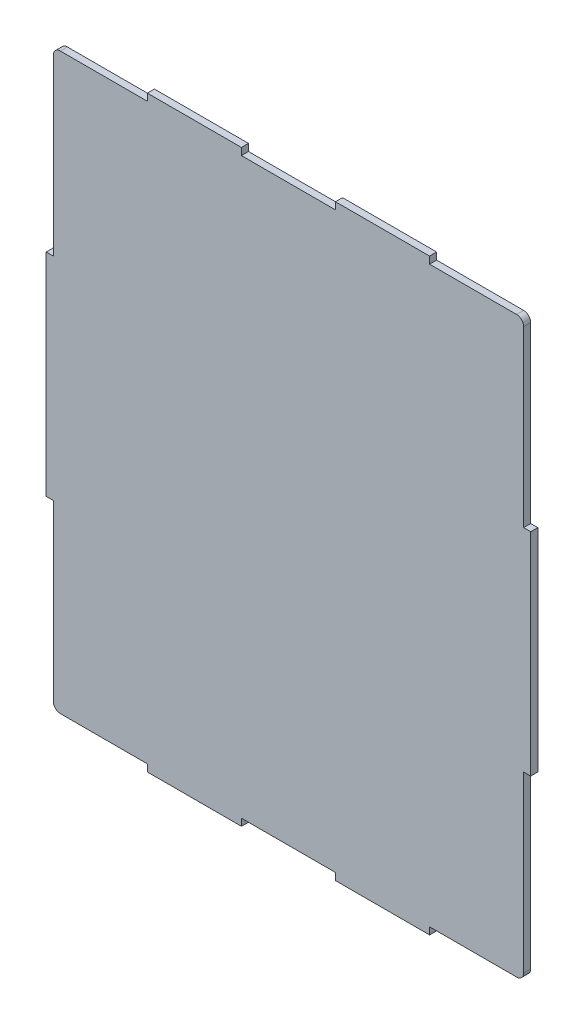
ISO-10303-21;
HEADER;
FILE_DESCRIPTION(('STEP AP214'),'2;1');
FILE_NAME('part.step','',(''),(''),'','','');
FILE_SCHEMA(('AUTOMOTIVE_DESIGN { 1 0 10303 214 1 1 1 1 }'));
ENDSEC;
DATA;
#1=APPLICATION_CONTEXT('core data for automotive mechanical design processes');
#2=APPLICATION_PROTOCOL_DEFINITION('international standard','automotive_design',2000,#1);
#3=PRODUCT_CONTEXT('',#1,'mechanical');
#4=PRODUCT('Part','Part','',(#3));
#5=PRODUCT_RELATED_PRODUCT_CATEGORY('part','',(#4));
#6=PRODUCT_DEFINITION_FORMATION('','',#4);
#7=PRODUCT_DEFINITION_CONTEXT('part definition',#1,'design');
#8=PRODUCT_DEFINITION('design','',#6,#7);
#9=PRODUCT_DEFINITION_SHAPE('','',#8);
#10=(LENGTH_UNIT() NAMED_UNIT(*) SI_UNIT(.MILLI.,.METRE.));
#11=(NAMED_UNIT(*) PLANE_ANGLE_UNIT() SI_UNIT($,.RADIAN.));
#12=(NAMED_UNIT(*) SI_UNIT($,.STERADIAN.) SOLID_ANGLE_UNIT());
#13=UNCERTAINTY_MEASURE_WITH_UNIT(LENGTH_MEASURE(1.E-05),#10,'distance_accuracy_value','');
#14=(GEOMETRIC_REPRESENTATION_CONTEXT(3) GLOBAL_UNCERTAINTY_ASSIGNED_CONTEXT((#13)) GLOBAL_UNIT_ASSIGNED_CONTEXT((#10,
#11,#12)) REPRESENTATION_CONTEXT('',''));
#15=CARTESIAN_POINT('',(0.,0.,0.));
#16=DIRECTION('',(0.,0.,1.));
#17=DIRECTION('',(1.,0.,0.));
#18=AXIS2_PLACEMENT_3D('',#15,#16,#17);
#19=CARTESIAN_POINT('',(0.,122.,3.));
#20=DIRECTION('',(0.,-1.,0.));
#21=DIRECTION('',(1.,0.,0.));
#22=AXIS2_PLACEMENT_3D('',#19,#20,#21);
#23=PLANE('',#22);
#24=DIRECTION('',(-1.,0.,0.));
#25=VECTOR('',#24,1.);
#26=CARTESIAN_POINT('',(0.,122.,0.));
#27=LINE('',#26,#25);
#28=CARTESIAN_POINT('',(96.9999999999999,122.,0.));
#29=VERTEX_POINT('',#28);
#30=CARTESIAN_POINT('',(60.,122.,0.));
#31=VERTEX_POINT('',#30);
#32=EDGE_CURVE('E384',#29,#31,#27,.T.);
#33=ORIENTED_EDGE('',*,*,#32,.T.);
#34=DIRECTION('',(0.,0.,-1.));
#35=VECTOR('',#34,1.);
#36=CARTESIAN_POINT('',(60.,122.,3.));
#37=LINE('',#36,#35);
#38=CARTESIAN_POINT('',(60.,122.,3.));
#39=VERTEX_POINT('',#38);
#40=EDGE_CURVE('E11',#39,#31,#37,.T.);
#41=ORIENTED_EDGE('',*,*,#40,.F.);
#42=DIRECTION('',(-1.,0.,0.));
#43=VECTOR('',#42,1.);
#44=CARTESIAN_POINT('',(0.,122.,3.));
#45=LINE('',#44,#43);
#46=CARTESIAN_POINT('',(96.9999999999999,122.,3.));
#47=VERTEX_POINT('',#46);
#48=EDGE_CURVE('E161',#47,#39,#45,.T.);
#49=ORIENTED_EDGE('',*,*,#48,.F.);
#50=DIRECTION('',(0.,0.,-1.));
#51=VECTOR('',#50,1.);
#52=CARTESIAN_POINT('',(96.9999999999999,122.,3.));
#53=LINE('',#52,#51);
#54=EDGE_CURVE('E52',#47,#29,#53,.T.);
#55=ORIENTED_EDGE('',*,*,#54,.T.);
#56=EDGE_LOOP('',(#33,#41,#49,#55));
#57=FACE_BOUND('',#56,.T.);
#58=ADVANCED_FACE('F35',(#57),#23,.F.);
#59=CARTESIAN_POINT('',(60.,0.,3.));
#60=DIRECTION('',(1.,0.,0.));
#61=DIRECTION('',(0.,0.,-1.));
#62=AXIS2_PLACEMENT_3D('',#59,#60,#61);
#63=PLANE('',#62);
#64=DIRECTION('',(0.,-1.,0.));
#65=VECTOR('',#64,1.);
#66=CARTESIAN_POINT('',(60.,0.,0.));
#67=LINE('',#66,#65);
#68=CARTESIAN_POINT('',(60.,125.,0.));
#69=VERTEX_POINT('',#68);
#70=EDGE_CURVE('E382',#69,#31,#67,.T.);
#71=ORIENTED_EDGE('',*,*,#70,.F.);
#72=DIRECTION('',(0.,0.,-1.));
#73=VECTOR('',#72,1.);
#74=CARTESIAN_POINT('',(60.,125.,3.));
#75=LINE('',#74,#73);
#76=CARTESIAN_POINT('',(60.,125.,3.));
#77=VERTEX_POINT('',#76);
#78=EDGE_CURVE('E44',#77,#69,#75,.T.);
#79=ORIENTED_EDGE('',*,*,#78,.F.);
#80=DIRECTION('',(0.,-1.,0.));
#81=VECTOR('',#80,1.);
#82=CARTESIAN_POINT('',(60.,0.,3.));
#83=LINE('',#82,#81);
#84=EDGE_CURVE('E335',#77,#39,#83,.T.);
#85=ORIENTED_EDGE('',*,*,#84,.T.);
#86=ORIENTED_EDGE('',*,*,#40,.T.);
#87=EDGE_LOOP('',(#71,#79,#85,#86));
#88=FACE_BOUND('',#87,.T.);
#89=ADVANCED_FACE('F37',(#88),#63,.T.);
#90=CARTESIAN_POINT('',(0.,125.,3.));
#91=DIRECTION('',(0.,1.,0.));
#92=DIRECTION('',(0.,0.,1.));
#93=AXIS2_PLACEMENT_3D('',#90,#91,#92);
#94=PLANE('',#93);
#95=DIRECTION('',(1.,0.,0.));
#96=VECTOR('',#95,1.);
#97=CARTESIAN_POINT('',(0.,125.,0.));
#98=LINE('',#97,#96);
#99=CARTESIAN_POINT('',(20.,125.,0.));
#100=VERTEX_POINT('',#99);
#101=EDGE_CURVE('E378',#100,#69,#98,.T.);
#102=ORIENTED_EDGE('',*,*,#101,.F.);
#103=DIRECTION('',(0.,0.,-1.));
#104=VECTOR('',#103,1.);
#105=CARTESIAN_POINT('',(20.,125.,3.));
#106=LINE('',#105,#104);
#107=CARTESIAN_POINT('',(20.,125.,3.));
#108=VERTEX_POINT('',#107);
#109=EDGE_CURVE('E372',#108,#100,#106,.T.);
#110=ORIENTED_EDGE('',*,*,#109,.F.);
#111=DIRECTION('',(1.,0.,0.));
#112=VECTOR('',#111,1.);
#113=CARTESIAN_POINT('',(0.,125.,3.));
#114=LINE('',#113,#112);
#115=EDGE_CURVE('E332',#108,#77,#114,.T.);
#116=ORIENTED_EDGE('',*,*,#115,.T.);
#117=ORIENTED_EDGE('',*,*,#78,.T.);
#118=EDGE_LOOP('',(#102,#110,#116,#117));
#119=FACE_BOUND('',#118,.T.);
#120=ADVANCED_FACE('F376',(#119),#94,.T.);
#121=CARTESIAN_POINT('',(19.9999999999998,0.,3.));
#122=DIRECTION('',(-1.,0.,0.));
#123=DIRECTION('',(0.,-1.,0.));
#124=AXIS2_PLACEMENT_3D('',#121,#122,#123);
#125=PLANE('',#124);
#126=DIRECTION('',(0.,1.,0.));
#127=VECTOR('',#126,1.);
#128=CARTESIAN_POINT('',(19.9999999999998,0.,0.));
#129=LINE('',#128,#127);
#130=CARTESIAN_POINT('',(20.,122.,0.));
#131=VERTEX_POINT('',#130);
#132=EDGE_CURVE('E388',#131,#100,#129,.T.);
#133=ORIENTED_EDGE('',*,*,#132,.F.);
#134=DIRECTION('',(0.,0.,-1.));
#135=VECTOR('',#134,1.);
#136=CARTESIAN_POINT('',(20.,122.,3.));
#137=LINE('',#136,#135);
#138=CARTESIAN_POINT('',(20.,122.,3.));
#139=VERTEX_POINT('',#138);
#140=EDGE_CURVE('E357',#139,#131,#137,.T.);
#141=ORIENTED_EDGE('',*,*,#140,.F.);
#142=DIRECTION('',(0.,1.,0.));
#143=VECTOR('',#142,1.);
#144=CARTESIAN_POINT('',(19.9999999999998,0.,3.));
#145=LINE('',#144,#143);
#146=EDGE_CURVE('E329',#139,#108,#145,.T.);
#147=ORIENTED_EDGE('',*,*,#146,.T.);
#148=ORIENTED_EDGE('',*,*,#109,.T.);
#149=EDGE_LOOP('',(#133,#141,#147,#148));
#150=FACE_BOUND('',#149,.T.);
#151=ADVANCED_FACE('F511',(#150),#125,.T.);
#152=CARTESIAN_POINT('',(-20.,122.,0.));
#153=VERTEX_POINT('',#152);
#154=EDGE_CURVE('E353',#131,#153,#27,.T.);
#155=ORIENTED_EDGE('',*,*,#154,.T.);
#156=DIRECTION('',(0.,0.,-1.));
#157=VECTOR('',#156,1.);
#158=CARTESIAN_POINT('',(-20.,122.,3.));
#159=LINE('',#158,#157);
#160=CARTESIAN_POINT('',(-20.,122.,3.));
#161=VERTEX_POINT('',#160);
#162=EDGE_CURVE('E350',#161,#153,#159,.T.);
#163=ORIENTED_EDGE('',*,*,#162,.F.);
#164=EDGE_CURVE('E328',#139,#161,#45,.T.);
#165=ORIENTED_EDGE('',*,*,#164,.F.);
#166=ORIENTED_EDGE('',*,*,#140,.T.);
#167=EDGE_LOOP('',(#155,#163,#165,#166));
#168=FACE_BOUND('',#167,.T.);
#169=ADVANCED_FACE('F351',(#168),#23,.F.);
#170=CARTESIAN_POINT('',(-19.9999999999999,0.,3.));
#171=DIRECTION('',(1.,0.,0.));
#172=DIRECTION('',(0.,1.,0.));
#173=AXIS2_PLACEMENT_3D('',#170,#171,#172);
#174=PLANE('',#173);
#175=DIRECTION('',(0.,-1.,0.));
#176=VECTOR('',#175,1.);
#177=CARTESIAN_POINT('',(-19.9999999999999,0.,0.));
#178=LINE('',#177,#176);
#179=CARTESIAN_POINT('',(-20.,125.,0.));
#180=VERTEX_POINT('',#179);
#181=EDGE_CURVE('E361',#180,#153,#178,.T.);
#182=ORIENTED_EDGE('',*,*,#181,.F.);
#183=DIRECTION('',(0.,0.,-1.));
#184=VECTOR('',#183,1.);
#185=CARTESIAN_POINT('',(-20.,125.,3.));
#186=LINE('',#185,#184);
#187=CARTESIAN_POINT('',(-20.,125.,3.));
#188=VERTEX_POINT('',#187);
#189=EDGE_CURVE('E358',#188,#180,#186,.T.);
#190=ORIENTED_EDGE('',*,*,#189,.F.);
#191=DIRECTION('',(0.,-1.,0.));
#192=VECTOR('',#191,1.);
#193=CARTESIAN_POINT('',(-19.9999999999999,0.,3.));
#194=LINE('',#193,#192);
#195=EDGE_CURVE('E325',#188,#161,#194,.T.);
#196=ORIENTED_EDGE('',*,*,#195,.T.);
#197=ORIENTED_EDGE('',*,*,#162,.T.);
#198=EDGE_LOOP('',(#182,#190,#196,#197));
#199=FACE_BOUND('',#198,.T.);
#200=ADVANCED_FACE('F360',(#199),#174,.T.);
#201=CARTESIAN_POINT('',(0.,125.,3.));
#202=DIRECTION('',(0.,1.,0.));
#203=DIRECTION('',(0.,0.,1.));
#204=AXIS2_PLACEMENT_3D('',#201,#202,#203);
#205=PLANE('',#204);
#206=DIRECTION('',(1.,0.,0.));
#207=VECTOR('',#206,1.);
#208=CARTESIAN_POINT('',(0.,125.,0.));
#209=LINE('',#208,#207);
#210=CARTESIAN_POINT('',(-60.,125.,0.));
#211=VERTEX_POINT('',#210);
#212=EDGE_CURVE('E394',#211,#180,#209,.T.);
#213=ORIENTED_EDGE('',*,*,#212,.F.);
#214=DIRECTION('',(0.,0.,-1.));
#215=VECTOR('',#214,1.);
#216=CARTESIAN_POINT('',(-60.,125.,3.));
#217=LINE('',#216,#215);
#218=CARTESIAN_POINT('',(-60.,125.,3.));
#219=VERTEX_POINT('',#218);
#220=EDGE_CURVE('E365',#219,#211,#217,.T.);
#221=ORIENTED_EDGE('',*,*,#220,.F.);
#222=DIRECTION('',(1.,0.,0.));
#223=VECTOR('',#222,1.);
#224=CARTESIAN_POINT('',(0.,125.,3.));
#225=LINE('',#224,#223);
#226=EDGE_CURVE('E322',#219,#188,#225,.T.);
#227=ORIENTED_EDGE('',*,*,#226,.T.);
#228=ORIENTED_EDGE('',*,*,#189,.T.);
#229=EDGE_LOOP('',(#213,#221,#227,#228));
#230=FACE_BOUND('',#229,.T.);
#231=ADVANCED_FACE('F509',(#230),#205,.T.);
#232=CARTESIAN_POINT('',(-60.,0.,3.));
#233=DIRECTION('',(-1.,0.,0.));
#234=DIRECTION('',(0.,0.,1.));
#235=AXIS2_PLACEMENT_3D('',#232,#233,#234);
#236=PLANE('',#235);
#237=DIRECTION('',(0.,1.,0.));
#238=VECTOR('',#237,1.);
#239=CARTESIAN_POINT('',(-60.,0.,0.));
#240=LINE('',#239,#238);
#241=CARTESIAN_POINT('',(-60.,122.,0.));
#242=VERTEX_POINT('',#241);
#243=EDGE_CURVE('E396',#242,#211,#240,.T.);
#244=ORIENTED_EDGE('',*,*,#243,.F.);
#245=DIRECTION('',(0.,0.,-1.));
#246=VECTOR('',#245,1.);
#247=CARTESIAN_POINT('',(-60.,122.,3.));
#248=LINE('',#247,#246);
#249=CARTESIAN_POINT('',(-60.,122.,3.));
#250=VERTEX_POINT('',#249);
#251=EDGE_CURVE('E367',#250,#242,#248,.T.);
#252=ORIENTED_EDGE('',*,*,#251,.F.);
#253=DIRECTION('',(0.,1.,0.));
#254=VECTOR('',#253,1.);
#255=CARTESIAN_POINT('',(-60.,0.,3.));
#256=LINE('',#255,#254);
#257=EDGE_CURVE('E319',#250,#219,#256,.T.);
#258=ORIENTED_EDGE('',*,*,#257,.T.);
#259=ORIENTED_EDGE('',*,*,#220,.T.);
#260=EDGE_LOOP('',(#244,#252,#258,#259));
#261=FACE_BOUND('',#260,.T.);
#262=ADVANCED_FACE('F508',(#261),#236,.T.);
#263=CARTESIAN_POINT('',(-97.,122.,0.));
#264=VERTEX_POINT('',#263);
#265=EDGE_CURVE('E399',#242,#264,#27,.T.);
#266=ORIENTED_EDGE('',*,*,#265,.T.);
#267=DIRECTION('',(0.,0.,-1.));
#268=VECTOR('',#267,1.);
#269=CARTESIAN_POINT('',(-97.,122.,3.));
#270=LINE('',#269,#268);
#271=CARTESIAN_POINT('',(-97.,122.,3.));
#272=VERTEX_POINT('',#271);
#273=EDGE_CURVE('E496',#272,#264,#270,.T.);
#274=ORIENTED_EDGE('',*,*,#273,.F.);
#275=EDGE_CURVE('E318',#250,#272,#45,.T.);
#276=ORIENTED_EDGE('',*,*,#275,.F.);
#277=ORIENTED_EDGE('',*,*,#251,.T.);
#278=EDGE_LOOP('',(#266,#274,#276,#277));
#279=FACE_BOUND('',#278,.T.);
#280=ADVANCED_FACE('F501',(#279),#23,.F.);
#281=CARTESIAN_POINT('',(-97.,119.,3.));
#282=DIRECTION('',(0.,0.,-1.));
#283=DIRECTION('',(-1.,0.,0.));
#284=AXIS2_PLACEMENT_3D('',#281,#282,#283);
#285=CYLINDRICAL_SURFACE('',#284,3.);
#286=CARTESIAN_POINT('',(-97.,119.,0.));
#287=DIRECTION('',(0.,0.,1.));
#288=DIRECTION('',(1.,0.,0.));
#289=AXIS2_PLACEMENT_3D('',#286,#287,#288);
#290=CIRCLE('',#289,3.);
#291=CARTESIAN_POINT('',(-100.,119.,0.));
#292=VERTEX_POINT('',#291);
#293=EDGE_CURVE('E400',#264,#292,#290,.T.);
#294=ORIENTED_EDGE('',*,*,#293,.T.);
#295=DIRECTION('',(0.,0.,-1.));
#296=VECTOR('',#295,1.);
#297=CARTESIAN_POINT('',(-100.,119.,3.));
#298=LINE('',#297,#296);
#299=CARTESIAN_POINT('',(-100.,119.,3.));
#300=VERTEX_POINT('',#299);
#301=EDGE_CURVE('E493',#300,#292,#298,.T.);
#302=ORIENTED_EDGE('',*,*,#301,.F.);
#303=CARTESIAN_POINT('',(-97.,119.,3.));
#304=DIRECTION('',(0.,0.,1.));
#305=DIRECTION('',(1.,0.,0.));
#306=AXIS2_PLACEMENT_3D('',#303,#304,#305);
#307=CIRCLE('',#306,3.);
#308=EDGE_CURVE('E316',#272,#300,#307,.T.);
#309=ORIENTED_EDGE('',*,*,#308,.F.);
#310=ORIENTED_EDGE('',*,*,#273,.T.);
#311=EDGE_LOOP('',(#294,#302,#309,#310));
#312=FACE_BOUND('',#311,.T.);
#313=ADVANCED_FACE('F527',(#312),#285,.T.);
#314=CARTESIAN_POINT('',(-100.,0.,3.));
#315=DIRECTION('',(1.,0.,0.));
#316=DIRECTION('',(0.,1.,0.));
#317=AXIS2_PLACEMENT_3D('',#314,#315,#316);
#318=PLANE('',#317);
#319=DIRECTION('',(0.,-1.,0.));
#320=VECTOR('',#319,1.);
#321=CARTESIAN_POINT('',(-100.,0.,0.));
#322=LINE('',#321,#320);
#323=CARTESIAN_POINT('',(-100.,45.,0.));
#324=VERTEX_POINT('',#323);
#325=EDGE_CURVE('E402',#292,#324,#322,.T.);
#326=ORIENTED_EDGE('',*,*,#325,.T.);
#327=DIRECTION('',(0.,0.,-1.));
#328=VECTOR('',#327,1.);
#329=CARTESIAN_POINT('',(-100.,45.,3.));
#330=LINE('',#329,#328);
#331=CARTESIAN_POINT('',(-100.,45.,3.));
#332=VERTEX_POINT('',#331);
#333=EDGE_CURVE('E490',#332,#324,#330,.T.);
#334=ORIENTED_EDGE('',*,*,#333,.F.);
#335=DIRECTION('',(0.,-1.,0.));
#336=VECTOR('',#335,1.);
#337=CARTESIAN_POINT('',(-100.,0.,3.));
#338=LINE('',#337,#336);
#339=EDGE_CURVE('E314',#300,#332,#338,.T.);
#340=ORIENTED_EDGE('',*,*,#339,.F.);
#341=ORIENTED_EDGE('',*,*,#301,.T.);
#342=EDGE_LOOP('',(#326,#334,#340,#341));
#343=FACE_BOUND('',#342,.T.);
#344=ADVANCED_FACE('F532',(#343),#318,.F.);
#345=CARTESIAN_POINT('',(0.,45.,3.));
#346=DIRECTION('',(0.,-1.,0.));
#347=DIRECTION('',(0.,0.,-1.));
#348=AXIS2_PLACEMENT_3D('',#345,#346,#347);
#349=PLANE('',#348);
#350=DIRECTION('',(-1.,0.,0.));
#351=VECTOR('',#350,1.);
#352=CARTESIAN_POINT('',(0.,45.,0.));
#353=LINE('',#352,#351);
#354=CARTESIAN_POINT('',(-103.,45.,0.));
#355=VERTEX_POINT('',#354);
#356=EDGE_CURVE('E404',#324,#355,#353,.T.);
#357=ORIENTED_EDGE('',*,*,#356,.T.);
#358=DIRECTION('',(0.,0.,-1.));
#359=VECTOR('',#358,1.);
#360=CARTESIAN_POINT('',(-103.,45.,3.));
#361=LINE('',#360,#359);
#362=CARTESIAN_POINT('',(-103.,45.,3.));
#363=VERTEX_POINT('',#362);
#364=EDGE_CURVE('E487',#363,#355,#361,.T.);
#365=ORIENTED_EDGE('',*,*,#364,.F.);
#366=DIRECTION('',(-1.,0.,0.));
#367=VECTOR('',#366,1.);
#368=CARTESIAN_POINT('',(0.,45.,3.));
#369=LINE('',#368,#367);
#370=EDGE_CURVE('E312',#332,#363,#369,.T.);
#371=ORIENTED_EDGE('',*,*,#370,.F.);
#372=ORIENTED_EDGE('',*,*,#333,.T.);
#373=EDGE_LOOP('',(#357,#365,#371,#372));
#374=FACE_BOUND('',#373,.T.);
#375=ADVANCED_FACE('F570',(#374),#349,.F.);
#376=CARTESIAN_POINT('',(-103.,0.,3.));
#377=DIRECTION('',(1.,0.,0.));
#378=DIRECTION('',(0.,1.,0.));
#379=AXIS2_PLACEMENT_3D('',#376,#377,#378);
#380=PLANE('',#379);
#381=DIRECTION('',(0.,-1.,0.));
#382=VECTOR('',#381,1.);
#383=CARTESIAN_POINT('',(-103.,0.,0.));
#384=LINE('',#383,#382);
#385=CARTESIAN_POINT('',(-103.,-45.,0.));
#386=VERTEX_POINT('',#385);
#387=EDGE_CURVE('E407',#355,#386,#384,.T.);
#388=ORIENTED_EDGE('',*,*,#387,.T.);
#389=DIRECTION('',(0.,0.,-1.));
#390=VECTOR('',#389,1.);
#391=CARTESIAN_POINT('',(-103.,-45.,3.));
#392=LINE('',#391,#390);
#393=CARTESIAN_POINT('',(-103.,-45.,3.));
#394=VERTEX_POINT('',#393);
#395=EDGE_CURVE('E484',#394,#386,#392,.T.);
#396=ORIENTED_EDGE('',*,*,#395,.F.);
#397=DIRECTION('',(0.,-1.,0.));
#398=VECTOR('',#397,1.);
#399=CARTESIAN_POINT('',(-103.,0.,3.));
#400=LINE('',#399,#398);
#401=EDGE_CURVE('E310',#363,#394,#400,.T.);
#402=ORIENTED_EDGE('',*,*,#401,.F.);
#403=ORIENTED_EDGE('',*,*,#364,.T.);
#404=EDGE_LOOP('',(#388,#396,#402,#403));
#405=FACE_BOUND('',#404,.T.);
#406=ADVANCED_FACE('F581',(#405),#380,.F.);
#407=CARTESIAN_POINT('',(0.,-45.,3.));
#408=DIRECTION('',(0.,1.,0.));
#409=DIRECTION('',(0.,0.,1.));
#410=AXIS2_PLACEMENT_3D('',#407,#408,#409);
#411=PLANE('',#410);
#412=DIRECTION('',(1.,0.,0.));
#413=VECTOR('',#412,1.);
#414=CARTESIAN_POINT('',(0.,-45.,0.));
#415=LINE('',#414,#413);
#416=CARTESIAN_POINT('',(-100.,-45.,0.));
#417=VERTEX_POINT('',#416);
#418=EDGE_CURVE('E409',#386,#417,#415,.T.);
#419=ORIENTED_EDGE('',*,*,#418,.T.);
#420=DIRECTION('',(0.,0.,-1.));
#421=VECTOR('',#420,1.);
#422=CARTESIAN_POINT('',(-100.,-45.,3.));
#423=LINE('',#422,#421);
#424=CARTESIAN_POINT('',(-100.,-45.,3.));
#425=VERTEX_POINT('',#424);
#426=EDGE_CURVE('E481',#425,#417,#423,.T.);
#427=ORIENTED_EDGE('',*,*,#426,.F.);
#428=DIRECTION('',(1.,0.,0.));
#429=VECTOR('',#428,1.);
#430=CARTESIAN_POINT('',(0.,-45.,3.));
#431=LINE('',#430,#429);
#432=EDGE_CURVE('E308',#394,#425,#431,.T.);
#433=ORIENTED_EDGE('',*,*,#432,.F.);
#434=ORIENTED_EDGE('',*,*,#395,.T.);
#435=EDGE_LOOP('',(#419,#427,#433,#434));
#436=FACE_BOUND('',#435,.T.);
#437=ADVANCED_FACE('F591',(#436),#411,.F.);
#438=CARTESIAN_POINT('',(-100.,-119.,0.));
#439=VERTEX_POINT('',#438);
#440=EDGE_CURVE('E405',#417,#439,#322,.T.);
#441=ORIENTED_EDGE('',*,*,#440,.T.);
#442=DIRECTION('',(0.,0.,-1.));
#443=VECTOR('',#442,1.);
#444=CARTESIAN_POINT('',(-100.,-119.,3.));
#445=LINE('',#444,#443);
#446=CARTESIAN_POINT('',(-100.,-119.,3.));
#447=VERTEX_POINT('',#446);
#448=EDGE_CURVE('E479',#447,#439,#445,.T.);
#449=ORIENTED_EDGE('',*,*,#448,.F.);
#450=EDGE_CURVE('E307',#425,#447,#338,.T.);
#451=ORIENTED_EDGE('',*,*,#450,.F.);
#452=ORIENTED_EDGE('',*,*,#426,.T.);
#453=EDGE_LOOP('',(#441,#449,#451,#452));
#454=FACE_BOUND('',#453,.T.);
#455=ADVANCED_FACE('F573',(#454),#318,.F.);
#456=CARTESIAN_POINT('',(-97.,-119.,3.));
#457=DIRECTION('',(0.,0.,-1.));
#458=DIRECTION('',(-1.,0.,0.));
#459=AXIS2_PLACEMENT_3D('',#456,#457,#458);
#460=CYLINDRICAL_SURFACE('',#459,3.);
#461=CARTESIAN_POINT('',(-97.,-119.,0.));
#462=DIRECTION('',(0.,0.,1.));
#463=DIRECTION('',(1.,0.,0.));
#464=AXIS2_PLACEMENT_3D('',#461,#462,#463);
#465=CIRCLE('',#464,3.);
#466=CARTESIAN_POINT('',(-97.,-122.,0.));
#467=VERTEX_POINT('',#466);
#468=EDGE_CURVE('E411',#467,#439,#465,.F.);
#469=ORIENTED_EDGE('',*,*,#468,.F.);
#470=DIRECTION('',(0.,0.,-1.));
#471=VECTOR('',#470,1.);
#472=CARTESIAN_POINT('',(-97.,-122.,3.));
#473=LINE('',#472,#471);
#474=CARTESIAN_POINT('',(-97.,-122.,3.));
#475=VERTEX_POINT('',#474);
#476=EDGE_CURVE('E477',#475,#467,#473,.T.);
#477=ORIENTED_EDGE('',*,*,#476,.F.);
#478=CARTESIAN_POINT('',(-97.,-119.,3.));
#479=DIRECTION('',(0.,0.,1.));
#480=DIRECTION('',(1.,0.,0.));
#481=AXIS2_PLACEMENT_3D('',#478,#479,#480);
#482=CIRCLE('',#481,3.);
#483=EDGE_CURVE('E304',#475,#447,#482,.F.);
#484=ORIENTED_EDGE('',*,*,#483,.T.);
#485=ORIENTED_EDGE('',*,*,#448,.T.);
#486=EDGE_LOOP('',(#469,#477,#484,#485));
#487=FACE_BOUND('',#486,.T.);
#488=ADVANCED_FACE('F610',(#487),#460,.T.);
#489=CARTESIAN_POINT('',(0.,-122.,3.));
#490=DIRECTION('',(0.,-1.,0.));
#491=DIRECTION('',(1.,0.,0.));
#492=AXIS2_PLACEMENT_3D('',#489,#490,#491);
#493=PLANE('',#492);
#494=DIRECTION('',(-1.,0.,0.));
#495=VECTOR('',#494,1.);
#496=CARTESIAN_POINT('',(0.,-122.,0.));
#497=LINE('',#496,#495);
#498=CARTESIAN_POINT('',(-60.,-122.,0.));
#499=VERTEX_POINT('',#498);
#500=EDGE_CURVE('E414',#499,#467,#497,.T.);
#501=ORIENTED_EDGE('',*,*,#500,.F.);
#502=DIRECTION('',(0.,0.,-1.));
#503=VECTOR('',#502,1.);
#504=CARTESIAN_POINT('',(-60.,-122.,3.));
#505=LINE('',#504,#503);
#506=CARTESIAN_POINT('',(-60.,-122.,3.));
#507=VERTEX_POINT('',#506);
#508=EDGE_CURVE('E475',#507,#499,#505,.T.);
#509=ORIENTED_EDGE('',*,*,#508,.F.);
#510=DIRECTION('',(-1.,0.,0.));
#511=VECTOR('',#510,1.);
#512=CARTESIAN_POINT('',(0.,-122.,3.));
#513=LINE('',#512,#511);
#514=EDGE_CURVE('E290',#507,#475,#513,.T.);
#515=ORIENTED_EDGE('',*,*,#514,.T.);
#516=ORIENTED_EDGE('',*,*,#476,.T.);
#517=EDGE_LOOP('',(#501,#509,#515,#516));
#518=FACE_BOUND('',#517,.T.);
#519=ADVANCED_FACE('F619',(#518),#493,.T.);
#520=CARTESIAN_POINT('',(-60.,0.,3.));
#521=DIRECTION('',(1.,0.,0.));
#522=DIRECTION('',(0.,0.,-1.));
#523=AXIS2_PLACEMENT_3D('',#520,#521,#522);
#524=PLANE('',#523);
#525=DIRECTION('',(0.,-1.,0.));
#526=VECTOR('',#525,1.);
#527=CARTESIAN_POINT('',(-60.,0.,0.));
#528=LINE('',#527,#526);
#529=CARTESIAN_POINT('',(-60.,-125.,0.));
#530=VERTEX_POINT('',#529);
#531=EDGE_CURVE('E417',#499,#530,#528,.T.);
#532=ORIENTED_EDGE('',*,*,#531,.T.);
#533=DIRECTION('',(0.,0.,-1.));
#534=VECTOR('',#533,1.);
#535=CARTESIAN_POINT('',(-60.,-125.,3.));
#536=LINE('',#535,#534);
#537=CARTESIAN_POINT('',(-60.,-125.,3.));
#538=VERTEX_POINT('',#537);
#539=EDGE_CURVE('E472',#538,#530,#536,.T.);
#540=ORIENTED_EDGE('',*,*,#539,.F.);
#541=DIRECTION('',(0.,-1.,0.));
#542=VECTOR('',#541,1.);
#543=CARTESIAN_POINT('',(-60.,0.,3.));
#544=LINE('',#543,#542);
#545=EDGE_CURVE('E301',#507,#538,#544,.T.);
#546=ORIENTED_EDGE('',*,*,#545,.F.);
#547=ORIENTED_EDGE('',*,*,#508,.T.);
#548=EDGE_LOOP('',(#532,#540,#546,#547));
#549=FACE_BOUND('',#548,.T.);
#550=ADVANCED_FACE('F629',(#549),#524,.F.);
#551=CARTESIAN_POINT('',(0.,-125.,3.));
#552=DIRECTION('',(0.,1.,0.));
#553=DIRECTION('',(0.,0.,1.));
#554=AXIS2_PLACEMENT_3D('',#551,#552,#553);
#555=PLANE('',#554);
#556=DIRECTION('',(1.,0.,0.));
#557=VECTOR('',#556,1.);
#558=CARTESIAN_POINT('',(0.,-125.,0.));
#559=LINE('',#558,#557);
#560=CARTESIAN_POINT('',(-20.,-125.,0.));
#561=VERTEX_POINT('',#560);
#562=EDGE_CURVE('E421',#530,#561,#559,.T.);
#563=ORIENTED_EDGE('',*,*,#562,.T.);
#564=DIRECTION('',(0.,0.,-1.));
#565=VECTOR('',#564,1.);
#566=CARTESIAN_POINT('',(-20.,-125.,3.));
#567=LINE('',#566,#565);
#568=CARTESIAN_POINT('',(-20.,-125.,3.));
#569=VERTEX_POINT('',#568);
#570=EDGE_CURVE('E469',#569,#561,#567,.T.);
#571=ORIENTED_EDGE('',*,*,#570,.F.);
#572=DIRECTION('',(1.,0.,0.));
#573=VECTOR('',#572,1.);
#574=CARTESIAN_POINT('',(0.,-125.,3.));
#575=LINE('',#574,#573);
#576=EDGE_CURVE('E299',#538,#569,#575,.T.);
#577=ORIENTED_EDGE('',*,*,#576,.F.);
#578=ORIENTED_EDGE('',*,*,#539,.T.);
#579=EDGE_LOOP('',(#563,#571,#577,#578));
#580=FACE_BOUND('',#579,.T.);
#581=ADVANCED_FACE('F641',(#580),#555,.F.);
#582=CARTESIAN_POINT('',(-20.,0.,3.));
#583=DIRECTION('',(-1.,0.,0.));
#584=DIRECTION('',(0.,0.,1.));
#585=AXIS2_PLACEMENT_3D('',#582,#583,#584);
#586=PLANE('',#585);
#587=DIRECTION('',(0.,1.,0.));
#588=VECTOR('',#587,1.);
#589=CARTESIAN_POINT('',(-20.,0.,0.));
#590=LINE('',#589,#588);
#591=CARTESIAN_POINT('',(-20.,-122.,0.));
#592=VERTEX_POINT('',#591);
#593=EDGE_CURVE('E423',#561,#592,#590,.T.);
#594=ORIENTED_EDGE('',*,*,#593,.T.);
#595=DIRECTION('',(0.,0.,-1.));
#596=VECTOR('',#595,1.);
#597=CARTESIAN_POINT('',(-20.,-122.,3.));
#598=LINE('',#597,#596);
#599=CARTESIAN_POINT('',(-20.,-122.,3.));
#600=VERTEX_POINT('',#599);
#601=EDGE_CURVE('E467',#600,#592,#598,.T.);
#602=ORIENTED_EDGE('',*,*,#601,.F.);
#603=DIRECTION('',(0.,1.,0.));
#604=VECTOR('',#603,1.);
#605=CARTESIAN_POINT('',(-20.,0.,3.));
#606=LINE('',#605,#604);
#607=EDGE_CURVE('E297',#569,#600,#606,.T.);
#608=ORIENTED_EDGE('',*,*,#607,.F.);
#609=ORIENTED_EDGE('',*,*,#570,.T.);
#610=EDGE_LOOP('',(#594,#602,#608,#609));
#611=FACE_BOUND('',#610,.T.);
#612=ADVANCED_FACE('F651',(#611),#586,.F.);
#613=CARTESIAN_POINT('',(20.,-122.,0.));
#614=VERTEX_POINT('',#613);
#615=EDGE_CURVE('E419',#614,#592,#497,.T.);
#616=ORIENTED_EDGE('',*,*,#615,.F.);
#617=DIRECTION('',(0.,0.,-1.));
#618=VECTOR('',#617,1.);
#619=CARTESIAN_POINT('',(20.,-122.,3.));
#620=LINE('',#619,#618);
#621=CARTESIAN_POINT('',(20.,-122.,3.));
#622=VERTEX_POINT('',#621);
#623=EDGE_CURVE('E465',#622,#614,#620,.T.);
#624=ORIENTED_EDGE('',*,*,#623,.F.);
#625=EDGE_CURVE('E289',#622,#600,#513,.T.);
#626=ORIENTED_EDGE('',*,*,#625,.T.);
#627=ORIENTED_EDGE('',*,*,#601,.T.);
#628=EDGE_LOOP('',(#616,#624,#626,#627));
#629=FACE_BOUND('',#628,.T.);
#630=ADVANCED_FACE('F632',(#629),#493,.T.);
#631=CARTESIAN_POINT('',(19.9999999999998,0.,3.));
#632=DIRECTION('',(1.,0.,0.));
#633=DIRECTION('',(0.,1.,0.));
#634=AXIS2_PLACEMENT_3D('',#631,#632,#633);
#635=PLANE('',#634);
#636=DIRECTION('',(0.,-1.,0.));
#637=VECTOR('',#636,1.);
#638=CARTESIAN_POINT('',(19.9999999999998,0.,0.));
#639=LINE('',#638,#637);
#640=CARTESIAN_POINT('',(20.,-125.,0.));
#641=VERTEX_POINT('',#640);
#642=EDGE_CURVE('E426',#614,#641,#639,.T.);
#643=ORIENTED_EDGE('',*,*,#642,.T.);
#644=DIRECTION('',(0.,0.,-1.));
#645=VECTOR('',#644,1.);
#646=CARTESIAN_POINT('',(20.,-125.,3.));
#647=LINE('',#646,#645);
#648=CARTESIAN_POINT('',(20.,-125.,3.));
#649=VERTEX_POINT('',#648);
#650=EDGE_CURVE('E462',#649,#641,#647,.T.);
#651=ORIENTED_EDGE('',*,*,#650,.F.);
#652=DIRECTION('',(0.,-1.,0.));
#653=VECTOR('',#652,1.);
#654=CARTESIAN_POINT('',(19.9999999999998,0.,3.));
#655=LINE('',#654,#653);
#656=EDGE_CURVE('E295',#622,#649,#655,.T.);
#657=ORIENTED_EDGE('',*,*,#656,.F.);
#658=ORIENTED_EDGE('',*,*,#623,.T.);
#659=EDGE_LOOP('',(#643,#651,#657,#658));
#660=FACE_BOUND('',#659,.T.);
#661=ADVANCED_FACE('F670',(#660),#635,.F.);
#662=CARTESIAN_POINT('',(0.,-125.,3.));
#663=DIRECTION('',(0.,1.,0.));
#664=DIRECTION('',(0.,0.,1.));
#665=AXIS2_PLACEMENT_3D('',#662,#663,#664);
#666=PLANE('',#665);
#667=DIRECTION('',(1.,0.,0.));
#668=VECTOR('',#667,1.);
#669=CARTESIAN_POINT('',(0.,-125.,0.));
#670=LINE('',#669,#668);
#671=CARTESIAN_POINT('',(60.,-125.,0.));
#672=VERTEX_POINT('',#671);
#673=EDGE_CURVE('E428',#641,#672,#670,.T.);
#674=ORIENTED_EDGE('',*,*,#673,.T.);
#675=DIRECTION('',(0.,0.,-1.));
#676=VECTOR('',#675,1.);
#677=CARTESIAN_POINT('',(60.,-125.,3.));
#678=LINE('',#677,#676);
#679=CARTESIAN_POINT('',(60.,-125.,3.));
#680=VERTEX_POINT('',#679);
#681=EDGE_CURVE('E459',#680,#672,#678,.T.);
#682=ORIENTED_EDGE('',*,*,#681,.F.);
#683=DIRECTION('',(1.,0.,0.));
#684=VECTOR('',#683,1.);
#685=CARTESIAN_POINT('',(0.,-125.,3.));
#686=LINE('',#685,#684);
#687=EDGE_CURVE('E293',#649,#680,#686,.T.);
#688=ORIENTED_EDGE('',*,*,#687,.F.);
#689=ORIENTED_EDGE('',*,*,#650,.T.);
#690=EDGE_LOOP('',(#674,#682,#688,#689));
#691=FACE_BOUND('',#690,.T.);
#692=ADVANCED_FACE('F679',(#691),#666,.F.);
#693=CARTESIAN_POINT('',(60.,0.,3.));
#694=DIRECTION('',(-1.,0.,0.));
#695=DIRECTION('',(0.,0.,1.));
#696=AXIS2_PLACEMENT_3D('',#693,#694,#695);
#697=PLANE('',#696);
#698=DIRECTION('',(0.,1.,0.));
#699=VECTOR('',#698,1.);
#700=CARTESIAN_POINT('',(60.,0.,0.));
#701=LINE('',#700,#699);
#702=CARTESIAN_POINT('',(60.,-122.,0.));
#703=VERTEX_POINT('',#702);
#704=EDGE_CURVE('E430',#672,#703,#701,.T.);
#705=ORIENTED_EDGE('',*,*,#704,.T.);
#706=DIRECTION('',(0.,0.,-1.));
#707=VECTOR('',#706,1.);
#708=CARTESIAN_POINT('',(60.,-122.,3.));
#709=LINE('',#708,#707);
#710=CARTESIAN_POINT('',(60.,-122.,3.));
#711=VERTEX_POINT('',#710);
#712=EDGE_CURVE('E457',#711,#703,#709,.T.);
#713=ORIENTED_EDGE('',*,*,#712,.F.);
#714=DIRECTION('',(0.,1.,0.));
#715=VECTOR('',#714,1.);
#716=CARTESIAN_POINT('',(60.,0.,3.));
#717=LINE('',#716,#715);
#718=EDGE_CURVE('E287',#680,#711,#717,.T.);
#719=ORIENTED_EDGE('',*,*,#718,.F.);
#720=ORIENTED_EDGE('',*,*,#681,.T.);
#721=EDGE_LOOP('',(#705,#713,#719,#720));
#722=FACE_BOUND('',#721,.T.);
#723=ADVANCED_FACE('F689',(#722),#697,.F.);
#724=CARTESIAN_POINT('',(97.,-122.,0.));
#725=VERTEX_POINT('',#724);
#726=EDGE_CURVE('E418',#725,#703,#497,.T.);
#727=ORIENTED_EDGE('',*,*,#726,.F.);
#728=DIRECTION('',(0.,0.,-1.));
#729=VECTOR('',#728,1.);
#730=CARTESIAN_POINT('',(97.,-122.,3.));
#731=LINE('',#730,#729);
#732=CARTESIAN_POINT('',(97.,-122.,3.));
#733=VERTEX_POINT('',#732);
#734=EDGE_CURVE('E455',#733,#725,#731,.T.);
#735=ORIENTED_EDGE('',*,*,#734,.F.);
#736=EDGE_CURVE('E283',#733,#711,#513,.T.);
#737=ORIENTED_EDGE('',*,*,#736,.T.);
#738=ORIENTED_EDGE('',*,*,#712,.T.);
#739=EDGE_LOOP('',(#727,#735,#737,#738));
#740=FACE_BOUND('',#739,.T.);
#741=ADVANCED_FACE('F633',(#740),#493,.T.);
#742=CARTESIAN_POINT('',(97.,-119.,3.));
#743=DIRECTION('',(0.,0.,-1.));
#744=DIRECTION('',(-1.,0.,0.));
#745=AXIS2_PLACEMENT_3D('',#742,#743,#744);
#746=CYLINDRICAL_SURFACE('',#745,3.);
#747=CARTESIAN_POINT('',(97.,-119.,0.));
#748=DIRECTION('',(0.,0.,1.));
#749=DIRECTION('',(1.,0.,0.));
#750=AXIS2_PLACEMENT_3D('',#747,#748,#749);
#751=CIRCLE('',#750,3.);
#752=CARTESIAN_POINT('',(100.,-119.,0.));
#753=VERTEX_POINT('',#752);
#754=EDGE_CURVE('E433',#753,#725,#751,.F.);
#755=ORIENTED_EDGE('',*,*,#754,.F.);
#756=DIRECTION('',(0.,0.,-1.));
#757=VECTOR('',#756,1.);
#758=CARTESIAN_POINT('',(100.,-119.,3.));
#759=LINE('',#758,#757);
#760=CARTESIAN_POINT('',(100.,-119.,3.));
#761=VERTEX_POINT('',#760);
#762=EDGE_CURVE('E453',#761,#753,#759,.T.);
#763=ORIENTED_EDGE('',*,*,#762,.F.);
#764=CARTESIAN_POINT('',(97.,-119.,3.));
#765=DIRECTION('',(0.,0.,1.));
#766=DIRECTION('',(1.,0.,0.));
#767=AXIS2_PLACEMENT_3D('',#764,#765,#766);
#768=CIRCLE('',#767,3.);
#769=EDGE_CURVE('E278',#761,#733,#768,.F.);
#770=ORIENTED_EDGE('',*,*,#769,.T.);
#771=ORIENTED_EDGE('',*,*,#734,.T.);
#772=EDGE_LOOP('',(#755,#763,#770,#771));
#773=FACE_BOUND('',#772,.T.);
#774=ADVANCED_FACE('F708',(#773),#746,.T.);
#775=CARTESIAN_POINT('',(100.,0.,3.));
#776=DIRECTION('',(1.,0.,0.));
#777=DIRECTION('',(0.,1.,0.));
#778=AXIS2_PLACEMENT_3D('',#775,#776,#777);
#779=PLANE('',#778);
#780=DIRECTION('',(0.,-1.,0.));
#781=VECTOR('',#780,1.);
#782=CARTESIAN_POINT('',(100.,0.,0.));
#783=LINE('',#782,#781);
#784=CARTESIAN_POINT('',(100.,-45.,0.));
#785=VERTEX_POINT('',#784);
#786=EDGE_CURVE('E436',#785,#753,#783,.T.);
#787=ORIENTED_EDGE('',*,*,#786,.F.);
#788=DIRECTION('',(0.,0.,-1.));
#789=VECTOR('',#788,1.);
#790=CARTESIAN_POINT('',(100.,-45.,3.));
#791=LINE('',#790,#789);
#792=CARTESIAN_POINT('',(100.,-45.,3.));
#793=VERTEX_POINT('',#792);
#794=EDGE_CURVE('E451',#793,#785,#791,.T.);
#795=ORIENTED_EDGE('',*,*,#794,.F.);
#796=DIRECTION('',(0.,-1.,0.));
#797=VECTOR('',#796,1.);
#798=CARTESIAN_POINT('',(100.,0.,3.));
#799=LINE('',#798,#797);
#800=EDGE_CURVE('E272',#793,#761,#799,.T.);
#801=ORIENTED_EDGE('',*,*,#800,.T.);
#802=ORIENTED_EDGE('',*,*,#762,.T.);
#803=EDGE_LOOP('',(#787,#795,#801,#802));
#804=FACE_BOUND('',#803,.T.);
#805=ADVANCED_FACE('F717',(#804),#779,.T.);
#806=CARTESIAN_POINT('',(0.,-45.,3.));
#807=DIRECTION('',(0.,-1.,0.));
#808=DIRECTION('',(0.,0.,-1.));
#809=AXIS2_PLACEMENT_3D('',#806,#807,#808);
#810=PLANE('',#809);
#811=DIRECTION('',(-1.,0.,0.));
#812=VECTOR('',#811,1.);
#813=CARTESIAN_POINT('',(0.,-45.,0.));
#814=LINE('',#813,#812);
#815=CARTESIAN_POINT('',(103.,-45.,0.));
#816=VERTEX_POINT('',#815);
#817=EDGE_CURVE('E439',#816,#785,#814,.T.);
#818=ORIENTED_EDGE('',*,*,#817,.F.);
#819=DIRECTION('',(0.,0.,-1.));
#820=VECTOR('',#819,1.);
#821=CARTESIAN_POINT('',(103.,-45.,3.));
#822=LINE('',#821,#820);
#823=CARTESIAN_POINT('',(103.,-45.,3.));
#824=VERTEX_POINT('',#823);
#825=EDGE_CURVE('E449',#824,#816,#822,.T.);
#826=ORIENTED_EDGE('',*,*,#825,.F.);
#827=DIRECTION('',(-1.,0.,0.));
#828=VECTOR('',#827,1.);
#829=CARTESIAN_POINT('',(0.,-45.,3.));
#830=LINE('',#829,#828);
#831=EDGE_CURVE('E277',#824,#793,#830,.T.);
#832=ORIENTED_EDGE('',*,*,#831,.T.);
#833=ORIENTED_EDGE('',*,*,#794,.T.);
#834=EDGE_LOOP('',(#818,#826,#832,#833));
#835=FACE_BOUND('',#834,.T.);
#836=ADVANCED_FACE('F726',(#835),#810,.T.);
#837=CARTESIAN_POINT('',(103.,0.,3.));
#838=DIRECTION('',(1.,0.,0.));
#839=DIRECTION('',(0.,1.,0.));
#840=AXIS2_PLACEMENT_3D('',#837,#838,#839);
#841=PLANE('',#840);
#842=DIRECTION('',(0.,-1.,0.));
#843=VECTOR('',#842,1.);
#844=CARTESIAN_POINT('',(103.,0.,0.));
#845=LINE('',#844,#843);
#846=CARTESIAN_POINT('',(103.,45.,0.));
#847=VERTEX_POINT('',#846);
#848=EDGE_CURVE('E442',#847,#816,#845,.T.);
#849=ORIENTED_EDGE('',*,*,#848,.F.);
#850=DIRECTION('',(0.,0.,-1.));
#851=VECTOR('',#850,1.);
#852=CARTESIAN_POINT('',(103.,45.,3.));
#853=LINE('',#852,#851);
#854=CARTESIAN_POINT('',(103.,45.,3.));
#855=VERTEX_POINT('',#854);
#856=EDGE_CURVE('E259',#855,#847,#853,.T.);
#857=ORIENTED_EDGE('',*,*,#856,.F.);
#858=DIRECTION('',(0.,-1.,0.));
#859=VECTOR('',#858,1.);
#860=CARTESIAN_POINT('',(103.,0.,3.));
#861=LINE('',#860,#859);
#862=EDGE_CURVE('E267',#855,#824,#861,.T.);
#863=ORIENTED_EDGE('',*,*,#862,.T.);
#864=ORIENTED_EDGE('',*,*,#825,.T.);
#865=EDGE_LOOP('',(#849,#857,#863,#864));
#866=FACE_BOUND('',#865,.T.);
#867=ADVANCED_FACE('F735',(#866),#841,.T.);
#868=CARTESIAN_POINT('',(1.04083408558609E-13,45.0000000000002,3.));
#869=DIRECTION('',(0.,1.,0.));
#870=DIRECTION('',(-1.,0.,0.));
#871=AXIS2_PLACEMENT_3D('',#868,#869,#870);
#872=PLANE('',#871);
#873=DIRECTION('',(1.,0.,0.));
#874=VECTOR('',#873,1.);
#875=CARTESIAN_POINT('',(1.04083408558609E-13,45.0000000000002,0.));
#876=LINE('',#875,#874);
#877=CARTESIAN_POINT('',(100.,45.,0.));
#878=VERTEX_POINT('',#877);
#879=EDGE_CURVE('E255',#878,#847,#876,.T.);
#880=ORIENTED_EDGE('',*,*,#879,.F.);
#881=DIRECTION('',(0.,0.,-1.));
#882=VECTOR('',#881,1.);
#883=CARTESIAN_POINT('',(100.,45.,3.));
#884=LINE('',#883,#882);
#885=CARTESIAN_POINT('',(100.,45.,3.));
#886=VERTEX_POINT('',#885);
#887=EDGE_CURVE('E250',#886,#878,#884,.T.);
#888=ORIENTED_EDGE('',*,*,#887,.F.);
#889=DIRECTION('',(1.,0.,0.));
#890=VECTOR('',#889,1.);
#891=CARTESIAN_POINT('',(1.04083408558609E-13,45.0000000000002,3.));
#892=LINE('',#891,#890);
#893=EDGE_CURVE('E253',#886,#855,#892,.T.);
#894=ORIENTED_EDGE('',*,*,#893,.T.);
#895=ORIENTED_EDGE('',*,*,#856,.T.);
#896=EDGE_LOOP('',(#880,#888,#894,#895));
#897=FACE_BOUND('',#896,.T.);
#898=ADVANCED_FACE('F252',(#897),#872,.T.);
#899=CARTESIAN_POINT('',(100.,119.,0.));
#900=VERTEX_POINT('',#899);
#901=EDGE_CURVE('E340',#900,#878,#783,.T.);
#902=ORIENTED_EDGE('',*,*,#901,.F.);
#903=DIRECTION('',(0.,0.,-1.));
#904=VECTOR('',#903,1.);
#905=CARTESIAN_POINT('',(100.,119.,3.));
#906=LINE('',#905,#904);
#907=CARTESIAN_POINT('',(100.,119.,3.));
#908=VERTEX_POINT('',#907);
#909=EDGE_CURVE('E149',#908,#900,#906,.T.);
#910=ORIENTED_EDGE('',*,*,#909,.F.);
#911=EDGE_CURVE('E264',#908,#886,#799,.T.);
#912=ORIENTED_EDGE('',*,*,#911,.T.);
#913=ORIENTED_EDGE('',*,*,#887,.T.);
#914=EDGE_LOOP('',(#902,#910,#912,#913));
#915=FACE_BOUND('',#914,.T.);
#916=ADVANCED_FACE('F269',(#915),#779,.T.);
#917=CARTESIAN_POINT('',(97.,119.,3.));
#918=DIRECTION('',(0.,0.,-1.));
#919=DIRECTION('',(-1.,0.,0.));
#920=AXIS2_PLACEMENT_3D('',#917,#918,#919);
#921=CYLINDRICAL_SURFACE('',#920,3.);
#922=CARTESIAN_POINT('',(97.,119.,0.));
#923=DIRECTION('',(0.,0.,1.));
#924=DIRECTION('',(1.,0.,0.));
#925=AXIS2_PLACEMENT_3D('',#922,#923,#924);
#926=CIRCLE('',#925,3.);
#927=EDGE_CURVE('E338',#29,#900,#926,.F.);
#928=ORIENTED_EDGE('',*,*,#927,.F.);
#929=ORIENTED_EDGE('',*,*,#54,.F.);
#930=CARTESIAN_POINT('',(97.,119.,3.));
#931=DIRECTION('',(0.,0.,1.));
#932=DIRECTION('',(1.,0.,0.));
#933=AXIS2_PLACEMENT_3D('',#930,#931,#932);
#934=CIRCLE('',#933,3.);
#935=EDGE_CURVE('E270',#47,#908,#934,.F.);
#936=ORIENTED_EDGE('',*,*,#935,.T.);
#937=ORIENTED_EDGE('',*,*,#909,.T.);
#938=EDGE_LOOP('',(#928,#929,#936,#937));
#939=FACE_BOUND('',#938,.T.);
#940=ADVANCED_FACE('F762',(#939),#921,.T.);
#941=CARTESIAN_POINT('',(0.,0.,3.));
#942=DIRECTION('',(0.,0.,1.));
#943=DIRECTION('',(1.,0.,0.));
#944=AXIS2_PLACEMENT_3D('',#941,#942,#943);
#945=PLANE('',#944);
#946=ORIENTED_EDGE('',*,*,#48,.T.);
#947=ORIENTED_EDGE('',*,*,#84,.F.);
#948=ORIENTED_EDGE('',*,*,#115,.F.);
#949=ORIENTED_EDGE('',*,*,#146,.F.);
#950=ORIENTED_EDGE('',*,*,#164,.T.);
#951=ORIENTED_EDGE('',*,*,#195,.F.);
#952=ORIENTED_EDGE('',*,*,#226,.F.);
#953=ORIENTED_EDGE('',*,*,#257,.F.);
#954=ORIENTED_EDGE('',*,*,#275,.T.);
#955=ORIENTED_EDGE('',*,*,#308,.T.);
#956=ORIENTED_EDGE('',*,*,#339,.T.);
#957=ORIENTED_EDGE('',*,*,#370,.T.);
#958=ORIENTED_EDGE('',*,*,#401,.T.);
#959=ORIENTED_EDGE('',*,*,#432,.T.);
#960=ORIENTED_EDGE('',*,*,#450,.T.);
#961=ORIENTED_EDGE('',*,*,#483,.F.);
#962=ORIENTED_EDGE('',*,*,#514,.F.);
#963=ORIENTED_EDGE('',*,*,#545,.T.);
#964=ORIENTED_EDGE('',*,*,#576,.T.);
#965=ORIENTED_EDGE('',*,*,#607,.T.);
#966=ORIENTED_EDGE('',*,*,#625,.F.);
#967=ORIENTED_EDGE('',*,*,#656,.T.);
#968=ORIENTED_EDGE('',*,*,#687,.T.);
#969=ORIENTED_EDGE('',*,*,#718,.T.);
#970=ORIENTED_EDGE('',*,*,#736,.F.);
#971=ORIENTED_EDGE('',*,*,#769,.F.);
#972=ORIENTED_EDGE('',*,*,#800,.F.);
#973=ORIENTED_EDGE('',*,*,#831,.F.);
#974=ORIENTED_EDGE('',*,*,#862,.F.);
#975=ORIENTED_EDGE('',*,*,#893,.F.);
#976=ORIENTED_EDGE('',*,*,#911,.F.);
#977=ORIENTED_EDGE('',*,*,#935,.F.);
#978=EDGE_LOOP('',(#946,#947,#948,#949,#950,#951,#952,#953,#954,#955,#956,#957,#958,#959,#960,
#961,#962,#963,#964,#965,#966,#967,#968,#969,#970,#971,#972,#973,#974,#975,#976,#977));
#979=FACE_BOUND('',#978,.T.);
#980=ADVANCED_FACE('F263',(#979),#945,.T.);
#981=CARTESIAN_POINT('',(0.,0.,0.));
#982=DIRECTION('',(0.,0.,1.));
#983=DIRECTION('',(1.,0.,0.));
#984=AXIS2_PLACEMENT_3D('',#981,#982,#983);
#985=PLANE('',#984);
#986=ORIENTED_EDGE('',*,*,#32,.F.);
#987=ORIENTED_EDGE('',*,*,#927,.T.);
#988=ORIENTED_EDGE('',*,*,#901,.T.);
#989=ORIENTED_EDGE('',*,*,#879,.T.);
#990=ORIENTED_EDGE('',*,*,#848,.T.);
#991=ORIENTED_EDGE('',*,*,#817,.T.);
#992=ORIENTED_EDGE('',*,*,#786,.T.);
#993=ORIENTED_EDGE('',*,*,#754,.T.);
#994=ORIENTED_EDGE('',*,*,#726,.T.);
#995=ORIENTED_EDGE('',*,*,#704,.F.);
#996=ORIENTED_EDGE('',*,*,#673,.F.);
#997=ORIENTED_EDGE('',*,*,#642,.F.);
#998=ORIENTED_EDGE('',*,*,#615,.T.);
#999=ORIENTED_EDGE('',*,*,#593,.F.);
#1000=ORIENTED_EDGE('',*,*,#562,.F.);
#1001=ORIENTED_EDGE('',*,*,#531,.F.);
#1002=ORIENTED_EDGE('',*,*,#500,.T.);
#1003=ORIENTED_EDGE('',*,*,#468,.T.);
#1004=ORIENTED_EDGE('',*,*,#440,.F.);
#1005=ORIENTED_EDGE('',*,*,#418,.F.);
#1006=ORIENTED_EDGE('',*,*,#387,.F.);
#1007=ORIENTED_EDGE('',*,*,#356,.F.);
#1008=ORIENTED_EDGE('',*,*,#325,.F.);
#1009=ORIENTED_EDGE('',*,*,#293,.F.);
#1010=ORIENTED_EDGE('',*,*,#265,.F.);
#1011=ORIENTED_EDGE('',*,*,#243,.T.);
#1012=ORIENTED_EDGE('',*,*,#212,.T.);
#1013=ORIENTED_EDGE('',*,*,#181,.T.);
#1014=ORIENTED_EDGE('',*,*,#154,.F.);
#1015=ORIENTED_EDGE('',*,*,#132,.T.);
#1016=ORIENTED_EDGE('',*,*,#101,.T.);
#1017=ORIENTED_EDGE('',*,*,#70,.T.);
#1018=EDGE_LOOP('',(#986,#987,#988,#989,#990,#991,#992,#993,#994,#995,#996,#997,#998,#999,#1000,
#1001,#1002,#1003,#1004,#1005,#1006,#1007,#1008,#1009,#1010,#1011,#1012,#1013,#1014,#1015,#1016,#1017));
#1019=FACE_BOUND('',#1018,.T.);
#1020=ADVANCED_FACE('F386',(#1019),#985,.F.);
#1021=CLOSED_SHELL('',(#58,#89,#120,#151,#169,#200,#231,#262,#280,#313,#344,#375,#406,#437,#455,
#488,#519,#550,#581,#612,#630,#661,#692,#723,#741,#774,#805,#836,#867,#898,#916,#940,#980,#1020));
#1022=MANIFOLD_SOLID_BREP('B2',#1021);
#1023=ADVANCED_BREP_SHAPE_REPRESENTATION('',(#18,#1022),#14);
#1024=SHAPE_DEFINITION_REPRESENTATION(#9,#1023);
ENDSEC;
END-ISO-10303-21;
